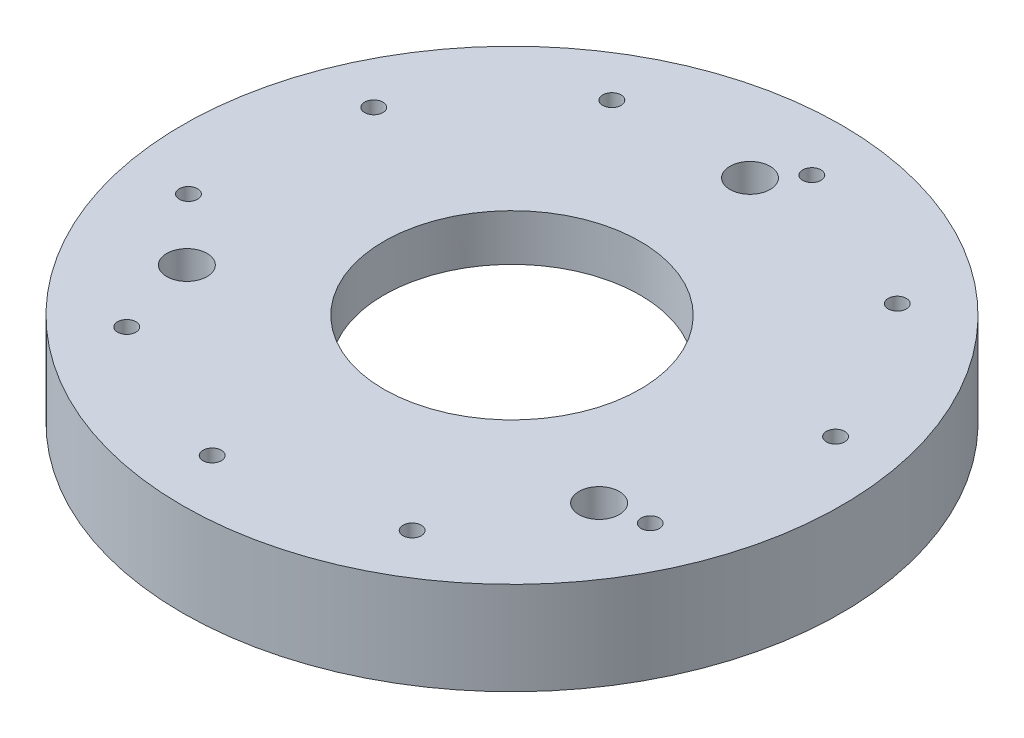
ISO-10303-21;
HEADER;
FILE_DESCRIPTION(('STEP AP214'),'2;1');
FILE_NAME('part.step','',(''),(''),'','','');
FILE_SCHEMA(('AUTOMOTIVE_DESIGN { 1 0 10303 214 1 1 1 1 }'));
ENDSEC;
DATA;
#1=APPLICATION_CONTEXT('core data for automotive mechanical design processes');
#2=APPLICATION_PROTOCOL_DEFINITION('international standard','automotive_design',2000,#1);
#3=PRODUCT_CONTEXT('',#1,'mechanical');
#4=PRODUCT('Part','Part','',(#3));
#5=PRODUCT_RELATED_PRODUCT_CATEGORY('part','',(#4));
#6=PRODUCT_DEFINITION_FORMATION('','',#4);
#7=PRODUCT_DEFINITION_CONTEXT('part definition',#1,'design');
#8=PRODUCT_DEFINITION('design','',#6,#7);
#9=PRODUCT_DEFINITION_SHAPE('','',#8);
#10=(LENGTH_UNIT() NAMED_UNIT(*) SI_UNIT(.MILLI.,.METRE.));
#11=(NAMED_UNIT(*) PLANE_ANGLE_UNIT() SI_UNIT($,.RADIAN.));
#12=(NAMED_UNIT(*) SI_UNIT($,.STERADIAN.) SOLID_ANGLE_UNIT());
#13=UNCERTAINTY_MEASURE_WITH_UNIT(LENGTH_MEASURE(1.E-05),#10,'distance_accuracy_value','');
#14=(GEOMETRIC_REPRESENTATION_CONTEXT(3) GLOBAL_UNCERTAINTY_ASSIGNED_CONTEXT((#13)) GLOBAL_UNIT_ASSIGNED_CONTEXT((#10,
#11,#12)) REPRESENTATION_CONTEXT('',''));
#15=CARTESIAN_POINT('',(0.,0.,0.));
#16=DIRECTION('',(0.,0.,1.));
#17=DIRECTION('',(1.,0.,0.));
#18=AXIS2_PLACEMENT_3D('',#15,#16,#17);
#19=CARTESIAN_POINT('',(0.,12.7,-32.5));
#20=DIRECTION('',(0.,-1.,0.));
#21=DIRECTION('',(0.,0.,-1.));
#22=AXIS2_PLACEMENT_3D('',#19,#20,#21);
#23=CYLINDRICAL_SURFACE('',#22,2.75);
#24=CARTESIAN_POINT('',(0.,12.7,-32.5));
#25=DIRECTION('',(0.,1.,0.));
#26=DIRECTION('',(0.,0.,1.));
#27=AXIS2_PLACEMENT_3D('',#24,#25,#26);
#28=CIRCLE('',#27,2.75);
#29=CARTESIAN_POINT('',(0.,12.7,-29.75));
#30=VERTEX_POINT('',#29);
#31=EDGE_CURVE('E203',#30,#30,#28,.T.);
#32=ORIENTED_EDGE('',*,*,#31,.T.);
#33=EDGE_LOOP('',(#32));
#34=FACE_BOUND('',#33,.T.);
#35=CARTESIAN_POINT('',(0.,6.35,-32.5));
#36=DIRECTION('',(0.,-1.,0.));
#37=DIRECTION('',(0.,0.,-1.));
#38=AXIS2_PLACEMENT_3D('',#35,#36,#37);
#39=CIRCLE('',#38,2.75);
#40=CARTESIAN_POINT('',(0.,6.35,-35.25));
#41=VERTEX_POINT('',#40);
#42=EDGE_CURVE('E120',#41,#41,#39,.T.);
#43=ORIENTED_EDGE('',*,*,#42,.T.);
#44=EDGE_LOOP('',(#43));
#45=FACE_BOUND('',#44,.T.);
#46=ADVANCED_FACE('F37',(#34,#45),#23,.F.);
#47=CARTESIAN_POINT('',(28.1458256229943,12.7,16.25));
#48=DIRECTION('',(0.,-1.,0.));
#49=DIRECTION('',(0.,0.,-1.));
#50=AXIS2_PLACEMENT_3D('',#47,#48,#49);
#51=CYLINDRICAL_SURFACE('',#50,2.75);
#52=CARTESIAN_POINT('',(28.1458256229943,12.7,16.25));
#53=DIRECTION('',(0.,1.,0.));
#54=DIRECTION('',(0.,0.,1.));
#55=AXIS2_PLACEMENT_3D('',#52,#53,#54);
#56=CIRCLE('',#55,2.75);
#57=CARTESIAN_POINT('',(28.1458256229943,12.7,19.));
#58=VERTEX_POINT('',#57);
#59=EDGE_CURVE('E196',#58,#58,#56,.T.);
#60=ORIENTED_EDGE('',*,*,#59,.T.);
#61=EDGE_LOOP('',(#60));
#62=FACE_BOUND('',#61,.T.);
#63=CARTESIAN_POINT('',(28.1458256229943,6.35,16.25));
#64=DIRECTION('',(0.,-1.,0.));
#65=DIRECTION('',(0.,0.,-1.));
#66=AXIS2_PLACEMENT_3D('',#63,#64,#65);
#67=CIRCLE('',#66,2.75);
#68=CARTESIAN_POINT('',(28.1458256229943,6.35,13.5));
#69=VERTEX_POINT('',#68);
#70=EDGE_CURVE('E116',#69,#69,#67,.T.);
#71=ORIENTED_EDGE('',*,*,#70,.T.);
#72=EDGE_LOOP('',(#71));
#73=FACE_BOUND('',#72,.T.);
#74=ADVANCED_FACE('F242',(#62,#73),#51,.F.);
#75=CARTESIAN_POINT('',(-28.1458256229943,12.7,16.25));
#76=DIRECTION('',(0.,-1.,0.));
#77=DIRECTION('',(0.,0.,-1.));
#78=AXIS2_PLACEMENT_3D('',#75,#76,#77);
#79=CYLINDRICAL_SURFACE('',#78,2.75);
#80=CARTESIAN_POINT('',(-28.1458256229943,12.7,16.25));
#81=DIRECTION('',(0.,1.,0.));
#82=DIRECTION('',(0.,0.,1.));
#83=AXIS2_PLACEMENT_3D('',#80,#81,#82);
#84=CIRCLE('',#83,2.75);
#85=CARTESIAN_POINT('',(-28.1458256229943,12.7,19.));
#86=VERTEX_POINT('',#85);
#87=EDGE_CURVE('E191',#86,#86,#84,.T.);
#88=ORIENTED_EDGE('',*,*,#87,.T.);
#89=EDGE_LOOP('',(#88));
#90=FACE_BOUND('',#89,.T.);
#91=CARTESIAN_POINT('',(-28.1458256229943,6.35,16.25));
#92=DIRECTION('',(0.,-1.,0.));
#93=DIRECTION('',(0.,0.,-1.));
#94=AXIS2_PLACEMENT_3D('',#91,#92,#93);
#95=CIRCLE('',#94,2.75);
#96=CARTESIAN_POINT('',(-28.1458256229943,6.35,13.5));
#97=VERTEX_POINT('',#96);
#98=EDGE_CURVE('E223',#97,#97,#95,.T.);
#99=ORIENTED_EDGE('',*,*,#98,.T.);
#100=EDGE_LOOP('',(#99));
#101=FACE_BOUND('',#100,.T.);
#102=ADVANCED_FACE('F244',(#90,#101),#79,.F.);
#103=CARTESIAN_POINT('',(0.,6.35,0.));
#104=DIRECTION('',(0.,-1.,0.));
#105=DIRECTION('',(0.,0.,-1.));
#106=AXIS2_PLACEMENT_3D('',#103,#104,#105);
#107=CYLINDRICAL_SURFACE('',#106,28.5);
#108=CARTESIAN_POINT('',(0.,6.35,0.));
#109=DIRECTION('',(0.,-1.,0.));
#110=DIRECTION('',(0.,0.,-1.));
#111=AXIS2_PLACEMENT_3D('',#108,#109,#110);
#112=CIRCLE('',#111,28.5);
#113=CARTESIAN_POINT('',(23.98200053742,6.35,15.3984950635828));
#114=VERTEX_POINT('',#113);
#115=CARTESIAN_POINT('',(-23.9820005374199,6.35,15.398495063583));
#116=VERTEX_POINT('',#115);
#117=EDGE_CURVE('E128',#114,#116,#112,.T.);
#118=ORIENTED_EDGE('',*,*,#117,.F.);
#119=DIRECTION('',(0.,-1.,0.));
#120=VECTOR('',#119,1.);
#121=CARTESIAN_POINT('',(23.98200053742,3.175,15.3984950635828));
#122=LINE('',#121,#120);
#123=CARTESIAN_POINT('',(23.98200053742,0.,15.3984950635828));
#124=VERTEX_POINT('',#123);
#125=EDGE_CURVE('E11',#114,#124,#122,.T.);
#126=ORIENTED_EDGE('',*,*,#125,.T.);
#127=CARTESIAN_POINT('',(0.,0.,0.));
#128=DIRECTION('',(0.,-1.,0.));
#129=DIRECTION('',(0.,0.,-1.));
#130=AXIS2_PLACEMENT_3D('',#127,#128,#129);
#131=CIRCLE('',#130,28.5);
#132=CARTESIAN_POINT('',(-23.9820005374199,0.,15.398495063583));
#133=VERTEX_POINT('',#132);
#134=EDGE_CURVE('E115',#124,#133,#131,.T.);
#135=ORIENTED_EDGE('',*,*,#134,.T.);
#136=DIRECTION('',(0.,-1.,0.));
#137=VECTOR('',#136,1.);
#138=CARTESIAN_POINT('',(-23.9820005374199,3.175,15.3984950635831));
#139=LINE('',#138,#137);
#140=EDGE_CURVE('E95',#133,#116,#139,.F.);
#141=ORIENTED_EDGE('',*,*,#140,.T.);
#142=EDGE_LOOP('',(#118,#126,#135,#141));
#143=FACE_BOUND('',#142,.T.);
#144=ADVANCED_FACE('F251',(#143),#107,.F.);
#145=CARTESIAN_POINT('',(1.34448763640207,0.,-28.4682692307692));
#146=VERTEX_POINT('',#145);
#147=CARTESIAN_POINT('',(25.326488173822,0.,13.0697741671864));
#148=VERTEX_POINT('',#147);
#149=EDGE_CURVE('E118',#146,#148,#131,.T.);
#150=ORIENTED_EDGE('',*,*,#149,.T.);
#151=DIRECTION('',(0.,-1.,0.));
#152=VECTOR('',#151,1.);
#153=CARTESIAN_POINT('',(25.326488173822,3.175,13.0697741671864));
#154=LINE('',#153,#152);
#155=CARTESIAN_POINT('',(25.326488173822,6.35,13.0697741671864));
#156=VERTEX_POINT('',#155);
#157=EDGE_CURVE('E45',#148,#156,#154,.F.);
#158=ORIENTED_EDGE('',*,*,#157,.T.);
#159=CARTESIAN_POINT('',(1.34448763640207,6.35,-28.4682692307692));
#160=VERTEX_POINT('',#159);
#161=EDGE_CURVE('E129',#160,#156,#112,.T.);
#162=ORIENTED_EDGE('',*,*,#161,.F.);
#163=DIRECTION('',(0.,-1.,0.));
#164=VECTOR('',#163,1.);
#165=CARTESIAN_POINT('',(1.34448763640213,3.175,-28.4682692307692));
#166=LINE('',#165,#164);
#167=EDGE_CURVE('E216',#160,#146,#166,.T.);
#168=ORIENTED_EDGE('',*,*,#167,.T.);
#169=EDGE_LOOP('',(#150,#158,#162,#168));
#170=FACE_BOUND('',#169,.T.);
#171=ADVANCED_FACE('F217',(#170),#107,.F.);
#172=CARTESIAN_POINT('',(0.,12.7,0.));
#173=DIRECTION('',(0.,1.,0.));
#174=DIRECTION('',(0.,0.,1.));
#175=AXIS2_PLACEMENT_3D('',#172,#173,#174);
#176=PLANE('',#175);
#177=CARTESIAN_POINT('',(0.,12.7,0.));
#178=DIRECTION('',(0.,1.,0.));
#179=DIRECTION('',(0.,0.,1.));
#180=AXIS2_PLACEMENT_3D('',#177,#178,#179);
#181=CIRCLE('',#180,17.5);
#182=CARTESIAN_POINT('',(0.,12.7,17.5));
#183=VERTEX_POINT('',#182);
#184=EDGE_CURVE('E133',#183,#183,#181,.T.);
#185=ORIENTED_EDGE('',*,*,#184,.F.);
#186=EDGE_LOOP('',(#185));
#187=FACE_BOUND('',#186,.T.);
#188=CARTESIAN_POINT('',(-3.8936852567201,12.7,37.0459406024682));
#189=DIRECTION('',(0.,1.,0.));
#190=DIRECTION('',(0.,0.,1.));
#191=AXIS2_PLACEMENT_3D('',#188,#189,#190);
#192=CIRCLE('',#191,1.25);
#193=CARTESIAN_POINT('',(-3.8936852567201,12.7,38.2959406024682));
#194=VERTEX_POINT('',#193);
#195=EDGE_CURVE('E146',#194,#194,#192,.T.);
#196=ORIENTED_EDGE('',*,*,#195,.F.);
#197=EDGE_LOOP('',(#196));
#198=FACE_BOUND('',#197,.T.);
#199=CARTESIAN_POINT('',(34.0295682971869,12.7,15.1509399545736));
#200=DIRECTION('',(0.,1.,0.));
#201=DIRECTION('',(0.,0.,1.));
#202=AXIS2_PLACEMENT_3D('',#199,#200,#201);
#203=CIRCLE('',#202,1.25000000000001);
#204=CARTESIAN_POINT('',(34.0295682971869,12.7,16.4009399545736));
#205=VERTEX_POINT('',#204);
#206=EDGE_CURVE('E158',#205,#205,#203,.T.);
#207=ORIENTED_EDGE('',*,*,#206,.F.);
#208=EDGE_LOOP('',(#207));
#209=FACE_BOUND('',#208,.T.);
#210=CARTESIAN_POINT('',(24.9251150868675,12.7,-27.6821447490329));
#211=DIRECTION('',(0.,1.,0.));
#212=DIRECTION('',(0.,0.,1.));
#213=AXIS2_PLACEMENT_3D('',#210,#211,#212);
#214=CIRCLE('',#213,1.25);
#215=CARTESIAN_POINT('',(24.9251150868675,12.7,-26.4321447490329));
#216=VERTEX_POINT('',#215);
#217=EDGE_CURVE('E170',#216,#216,#214,.T.);
#218=ORIENTED_EDGE('',*,*,#217,.F.);
#219=EDGE_LOOP('',(#218));
#220=FACE_BOUND('',#219,.T.);
#221=CARTESIAN_POINT('',(-18.625,12.7,-32.2594462909704));
#222=DIRECTION('',(0.,1.,0.));
#223=DIRECTION('',(0.,0.,1.));
#224=AXIS2_PLACEMENT_3D('',#221,#222,#223);
#225=CIRCLE('',#224,1.25);
#226=CARTESIAN_POINT('',(-18.625,12.7,-31.0094462909704));
#227=VERTEX_POINT('',#226);
#228=EDGE_CURVE('E182',#227,#227,#225,.T.);
#229=ORIENTED_EDGE('',*,*,#228,.F.);
#230=EDGE_LOOP('',(#229));
#231=FACE_BOUND('',#230,.T.);
#232=ORIENTED_EDGE('',*,*,#87,.F.);
#233=EDGE_LOOP('',(#232));
#234=FACE_BOUND('',#233,.T.);
#235=CARTESIAN_POINT('',(-36.4359981273343,12.7,7.74471048296152));
#236=DIRECTION('',(0.,1.,0.));
#237=DIRECTION('',(0.,0.,1.));
#238=AXIS2_PLACEMENT_3D('',#235,#236,#237);
#239=CIRCLE('',#238,1.25000000000001);
#240=CARTESIAN_POINT('',(-36.4359981273343,12.7,8.99471048296152));
#241=VERTEX_POINT('',#240);
#242=EDGE_CURVE('E200',#241,#241,#239,.T.);
#243=ORIENTED_EDGE('',*,*,#242,.F.);
#244=EDGE_LOOP('',(#243));
#245=FACE_BOUND('',#244,.T.);
#246=CARTESIAN_POINT('',(0.,12.7,0.));
#247=DIRECTION('',(0.,1.,0.));
#248=DIRECTION('',(0.,0.,1.));
#249=AXIS2_PLACEMENT_3D('',#246,#247,#248);
#250=CIRCLE('',#249,45.);
#251=CARTESIAN_POINT('',(0.,12.7,45.));
#252=VERTEX_POINT('',#251);
#253=EDGE_CURVE('E209',#252,#252,#250,.T.);
#254=ORIENTED_EDGE('',*,*,#253,.T.);
#255=EDGE_LOOP('',(#254));
#256=FACE_BOUND('',#255,.T.);
#257=ORIENTED_EDGE('',*,*,#31,.F.);
#258=EDGE_LOOP('',(#257));
#259=FACE_BOUND('',#258,.T.);
#260=ORIENTED_EDGE('',*,*,#59,.F.);
#261=EDGE_LOOP('',(#260));
#262=FACE_BOUND('',#261,.T.);
#263=CARTESIAN_POINT('',(-34.0295682971869,12.7,-15.1509399545736));
#264=DIRECTION('',(0.,1.,0.));
#265=DIRECTION('',(0.,0.,1.));
#266=AXIS2_PLACEMENT_3D('',#263,#264,#265);
#267=CIRCLE('',#266,1.25000000000001);
#268=CARTESIAN_POINT('',(-34.0295682971869,12.7,-13.9009399545736));
#269=VERTEX_POINT('',#268);
#270=EDGE_CURVE('E188',#269,#269,#267,.T.);
#271=ORIENTED_EDGE('',*,*,#270,.F.);
#272=EDGE_LOOP('',(#271));
#273=FACE_BOUND('',#272,.T.);
#274=CARTESIAN_POINT('',(3.8936852567201,12.7,-37.0459406024682));
#275=DIRECTION('',(0.,1.,0.));
#276=DIRECTION('',(0.,0.,1.));
#277=AXIS2_PLACEMENT_3D('',#274,#275,#276);
#278=CIRCLE('',#277,1.25);
#279=CARTESIAN_POINT('',(3.8936852567201,12.7,-35.7959406024682));
#280=VERTEX_POINT('',#279);
#281=EDGE_CURVE('E176',#280,#280,#278,.T.);
#282=ORIENTED_EDGE('',*,*,#281,.F.);
#283=EDGE_LOOP('',(#282));
#284=FACE_BOUND('',#283,.T.);
#285=CARTESIAN_POINT('',(36.4359981273343,12.7,-7.74471048296153));
#286=DIRECTION('',(0.,1.,0.));
#287=DIRECTION('',(0.,0.,1.));
#288=AXIS2_PLACEMENT_3D('',#285,#286,#287);
#289=CIRCLE('',#288,1.25);
#290=CARTESIAN_POINT('',(36.4359981273343,12.7,-6.49471048296152));
#291=VERTEX_POINT('',#290);
#292=EDGE_CURVE('E164',#291,#291,#289,.T.);
#293=ORIENTED_EDGE('',*,*,#292,.F.);
#294=EDGE_LOOP('',(#293));
#295=FACE_BOUND('',#294,.T.);
#296=CARTESIAN_POINT('',(18.625,12.7,32.2594462909704));
#297=DIRECTION('',(0.,1.,0.));
#298=DIRECTION('',(0.,0.,1.));
#299=AXIS2_PLACEMENT_3D('',#296,#297,#298);
#300=CIRCLE('',#299,1.25);
#301=CARTESIAN_POINT('',(18.625,12.7,33.5094462909704));
#302=VERTEX_POINT('',#301);
#303=EDGE_CURVE('E152',#302,#302,#300,.T.);
#304=ORIENTED_EDGE('',*,*,#303,.F.);
#305=EDGE_LOOP('',(#304));
#306=FACE_BOUND('',#305,.T.);
#307=CARTESIAN_POINT('',(-24.9251150868675,12.7,27.6821447490329));
#308=DIRECTION('',(0.,1.,0.));
#309=DIRECTION('',(0.,0.,1.));
#310=AXIS2_PLACEMENT_3D('',#307,#308,#309);
#311=CIRCLE('',#310,1.25);
#312=CARTESIAN_POINT('',(-24.9251150868675,12.7,28.9321447490329));
#313=VERTEX_POINT('',#312);
#314=EDGE_CURVE('E140',#313,#313,#311,.T.);
#315=ORIENTED_EDGE('',*,*,#314,.F.);
#316=EDGE_LOOP('',(#315));
#317=FACE_BOUND('',#316,.T.);
#318=ADVANCED_FACE('F263',(#187,#198,#209,#220,#231,#234,#245,#256,#259,#262,#273,#284,#295,
#306,#317),#176,.T.);
#319=CARTESIAN_POINT('',(0.,0.,0.));
#320=DIRECTION('',(0.,1.,0.));
#321=DIRECTION('',(0.,0.,1.));
#322=AXIS2_PLACEMENT_3D('',#319,#320,#321);
#323=PLANE('',#322);
#324=ORIENTED_EDGE('',*,*,#134,.F.);
#325=CARTESIAN_POINT('',(28.1458256229943,0.,16.25));
#326=DIRECTION('',(0.,-1.,0.));
#327=DIRECTION('',(0.,0.,-1.));
#328=AXIS2_PLACEMENT_3D('',#325,#326,#327);
#329=CIRCLE('',#328,4.25);
#330=EDGE_CURVE('E221',#148,#124,#329,.T.);
#331=ORIENTED_EDGE('',*,*,#330,.F.);
#332=ORIENTED_EDGE('',*,*,#149,.F.);
#333=CARTESIAN_POINT('',(0.,0.,-32.5));
#334=DIRECTION('',(0.,-1.,0.));
#335=DIRECTION('',(0.,0.,-1.));
#336=AXIS2_PLACEMENT_3D('',#333,#334,#335);
#337=CIRCLE('',#336,4.25000000000003);
#338=CARTESIAN_POINT('',(-1.34448763640202,0.,-28.4682692307692));
#339=VERTEX_POINT('',#338);
#340=EDGE_CURVE('E114',#339,#146,#337,.T.);
#341=ORIENTED_EDGE('',*,*,#340,.F.);
#342=CARTESIAN_POINT('',(-25.3264881738221,0.,13.0697741671862));
#343=VERTEX_POINT('',#342);
#344=EDGE_CURVE('E106',#343,#339,#131,.T.);
#345=ORIENTED_EDGE('',*,*,#344,.F.);
#346=CARTESIAN_POINT('',(-28.1458256229943,0.,16.25));
#347=DIRECTION('',(0.,-1.,0.));
#348=DIRECTION('',(0.,0.,-1.));
#349=AXIS2_PLACEMENT_3D('',#346,#347,#348);
#350=CIRCLE('',#349,4.25000000000007);
#351=EDGE_CURVE('E89',#133,#343,#350,.T.);
#352=ORIENTED_EDGE('',*,*,#351,.F.);
#353=EDGE_LOOP('',(#324,#331,#332,#341,#345,#352));
#354=FACE_BOUND('',#353,.T.);
#355=CARTESIAN_POINT('',(0.,0.,0.));
#356=DIRECTION('',(0.,1.,0.));
#357=DIRECTION('',(0.,0.,1.));
#358=AXIS2_PLACEMENT_3D('',#355,#356,#357);
#359=CIRCLE('',#358,45.);
#360=CARTESIAN_POINT('',(0.,0.,45.));
#361=VERTEX_POINT('',#360);
#362=EDGE_CURVE('E208',#361,#361,#359,.T.);
#363=ORIENTED_EDGE('',*,*,#362,.F.);
#364=EDGE_LOOP('',(#363));
#365=FACE_BOUND('',#364,.T.);
#366=CARTESIAN_POINT('',(-36.4359981273343,0.,7.74471048296152));
#367=DIRECTION('',(0.,1.,0.));
#368=DIRECTION('',(0.,0.,1.));
#369=AXIS2_PLACEMENT_3D('',#366,#367,#368);
#370=CIRCLE('',#369,1.25000000000001);
#371=CARTESIAN_POINT('',(-36.4359981273343,0.,8.99471048296152));
#372=VERTEX_POINT('',#371);
#373=EDGE_CURVE('E199',#372,#372,#370,.T.);
#374=ORIENTED_EDGE('',*,*,#373,.T.);
#375=EDGE_LOOP('',(#374));
#376=FACE_BOUND('',#375,.T.);
#377=CARTESIAN_POINT('',(-34.0295682971869,0.,-15.1509399545736));
#378=DIRECTION('',(0.,1.,0.));
#379=DIRECTION('',(0.,0.,1.));
#380=AXIS2_PLACEMENT_3D('',#377,#378,#379);
#381=CIRCLE('',#380,1.25000000000001);
#382=CARTESIAN_POINT('',(-34.0295682971869,0.,-13.9009399545736));
#383=VERTEX_POINT('',#382);
#384=EDGE_CURVE('E185',#383,#383,#381,.T.);
#385=ORIENTED_EDGE('',*,*,#384,.T.);
#386=EDGE_LOOP('',(#385));
#387=FACE_BOUND('',#386,.T.);
#388=CARTESIAN_POINT('',(-18.625,0.,-32.2594462909704));
#389=DIRECTION('',(0.,1.,0.));
#390=DIRECTION('',(0.,0.,1.));
#391=AXIS2_PLACEMENT_3D('',#388,#389,#390);
#392=CIRCLE('',#391,1.25);
#393=CARTESIAN_POINT('',(-18.625,0.,-31.0094462909704));
#394=VERTEX_POINT('',#393);
#395=EDGE_CURVE('E179',#394,#394,#392,.T.);
#396=ORIENTED_EDGE('',*,*,#395,.T.);
#397=EDGE_LOOP('',(#396));
#398=FACE_BOUND('',#397,.T.);
#399=CARTESIAN_POINT('',(3.8936852567201,0.,-37.0459406024682));
#400=DIRECTION('',(0.,1.,0.));
#401=DIRECTION('',(0.,0.,1.));
#402=AXIS2_PLACEMENT_3D('',#399,#400,#401);
#403=CIRCLE('',#402,1.25);
#404=CARTESIAN_POINT('',(3.8936852567201,0.,-35.7959406024682));
#405=VERTEX_POINT('',#404);
#406=EDGE_CURVE('E173',#405,#405,#403,.T.);
#407=ORIENTED_EDGE('',*,*,#406,.T.);
#408=EDGE_LOOP('',(#407));
#409=FACE_BOUND('',#408,.T.);
#410=CARTESIAN_POINT('',(24.9251150868675,0.,-27.6821447490329));
#411=DIRECTION('',(0.,1.,0.));
#412=DIRECTION('',(0.,0.,1.));
#413=AXIS2_PLACEMENT_3D('',#410,#411,#412);
#414=CIRCLE('',#413,1.25);
#415=CARTESIAN_POINT('',(24.9251150868675,0.,-26.4321447490329));
#416=VERTEX_POINT('',#415);
#417=EDGE_CURVE('E167',#416,#416,#414,.T.);
#418=ORIENTED_EDGE('',*,*,#417,.T.);
#419=EDGE_LOOP('',(#418));
#420=FACE_BOUND('',#419,.T.);
#421=CARTESIAN_POINT('',(36.4359981273343,0.,-7.74471048296153));
#422=DIRECTION('',(0.,1.,0.));
#423=DIRECTION('',(0.,0.,1.));
#424=AXIS2_PLACEMENT_3D('',#421,#422,#423);
#425=CIRCLE('',#424,1.25);
#426=CARTESIAN_POINT('',(36.4359981273343,0.,-6.49471048296152));
#427=VERTEX_POINT('',#426);
#428=EDGE_CURVE('E161',#427,#427,#425,.T.);
#429=ORIENTED_EDGE('',*,*,#428,.T.);
#430=EDGE_LOOP('',(#429));
#431=FACE_BOUND('',#430,.T.);
#432=CARTESIAN_POINT('',(34.0295682971869,0.,15.1509399545736));
#433=DIRECTION('',(0.,1.,0.));
#434=DIRECTION('',(0.,0.,1.));
#435=AXIS2_PLACEMENT_3D('',#432,#433,#434);
#436=CIRCLE('',#435,1.25000000000001);
#437=CARTESIAN_POINT('',(34.0295682971869,0.,16.4009399545736));
#438=VERTEX_POINT('',#437);
#439=EDGE_CURVE('E155',#438,#438,#436,.T.);
#440=ORIENTED_EDGE('',*,*,#439,.T.);
#441=EDGE_LOOP('',(#440));
#442=FACE_BOUND('',#441,.T.);
#443=CARTESIAN_POINT('',(18.625,0.,32.2594462909704));
#444=DIRECTION('',(0.,1.,0.));
#445=DIRECTION('',(0.,0.,1.));
#446=AXIS2_PLACEMENT_3D('',#443,#444,#445);
#447=CIRCLE('',#446,1.25);
#448=CARTESIAN_POINT('',(18.625,0.,33.5094462909704));
#449=VERTEX_POINT('',#448);
#450=EDGE_CURVE('E149',#449,#449,#447,.T.);
#451=ORIENTED_EDGE('',*,*,#450,.T.);
#452=EDGE_LOOP('',(#451));
#453=FACE_BOUND('',#452,.T.);
#454=CARTESIAN_POINT('',(-3.8936852567201,0.,37.0459406024682));
#455=DIRECTION('',(0.,1.,0.));
#456=DIRECTION('',(0.,0.,1.));
#457=AXIS2_PLACEMENT_3D('',#454,#455,#456);
#458=CIRCLE('',#457,1.25);
#459=CARTESIAN_POINT('',(-3.8936852567201,0.,38.2959406024682));
#460=VERTEX_POINT('',#459);
#461=EDGE_CURVE('E143',#460,#460,#458,.T.);
#462=ORIENTED_EDGE('',*,*,#461,.T.);
#463=EDGE_LOOP('',(#462));
#464=FACE_BOUND('',#463,.T.);
#465=CARTESIAN_POINT('',(-24.9251150868675,0.,27.6821447490329));
#466=DIRECTION('',(0.,1.,0.));
#467=DIRECTION('',(0.,0.,1.));
#468=AXIS2_PLACEMENT_3D('',#465,#466,#467);
#469=CIRCLE('',#468,1.25);
#470=CARTESIAN_POINT('',(-24.9251150868675,0.,28.9321447490329));
#471=VERTEX_POINT('',#470);
#472=EDGE_CURVE('E137',#471,#471,#469,.T.);
#473=ORIENTED_EDGE('',*,*,#472,.T.);
#474=EDGE_LOOP('',(#473));
#475=FACE_BOUND('',#474,.T.);
#476=ADVANCED_FACE('F111',(#354,#365,#376,#387,#398,#409,#420,#431,#442,#453,#464,#475),#323,.F.);
#477=CARTESIAN_POINT('',(0.,12.7,0.));
#478=DIRECTION('',(0.,-1.,0.));
#479=DIRECTION('',(0.,0.,-1.));
#480=AXIS2_PLACEMENT_3D('',#477,#478,#479);
#481=CYLINDRICAL_SURFACE('',#480,45.);
#482=ORIENTED_EDGE('',*,*,#253,.F.);
#483=EDGE_LOOP('',(#482));
#484=FACE_BOUND('',#483,.T.);
#485=ORIENTED_EDGE('',*,*,#362,.T.);
#486=EDGE_LOOP('',(#485));
#487=FACE_BOUND('',#486,.T.);
#488=ADVANCED_FACE('F39',(#484,#487),#481,.T.);
#489=CARTESIAN_POINT('',(-36.4359981273343,12.7,7.74471048296152));
#490=DIRECTION('',(0.,-1.,0.));
#491=DIRECTION('',(0.,0.,-1.));
#492=AXIS2_PLACEMENT_3D('',#489,#490,#491);
#493=CYLINDRICAL_SURFACE('',#492,1.25000000000001);
#494=ORIENTED_EDGE('',*,*,#242,.T.);
#495=EDGE_LOOP('',(#494));
#496=FACE_BOUND('',#495,.T.);
#497=ORIENTED_EDGE('',*,*,#373,.F.);
#498=EDGE_LOOP('',(#497));
#499=FACE_BOUND('',#498,.T.);
#500=ADVANCED_FACE('F258',(#496,#499),#493,.F.);
#501=CARTESIAN_POINT('',(-34.0295682971869,12.7,-15.1509399545736));
#502=DIRECTION('',(0.,-1.,0.));
#503=DIRECTION('',(0.,0.,-1.));
#504=AXIS2_PLACEMENT_3D('',#501,#502,#503);
#505=CYLINDRICAL_SURFACE('',#504,1.25000000000001);
#506=ORIENTED_EDGE('',*,*,#270,.T.);
#507=EDGE_LOOP('',(#506));
#508=FACE_BOUND('',#507,.T.);
#509=ORIENTED_EDGE('',*,*,#384,.F.);
#510=EDGE_LOOP('',(#509));
#511=FACE_BOUND('',#510,.T.);
#512=ADVANCED_FACE('F260',(#508,#511),#505,.F.);
#513=CARTESIAN_POINT('',(-18.625,12.7,-32.2594462909704));
#514=DIRECTION('',(0.,-1.,0.));
#515=DIRECTION('',(0.,0.,-1.));
#516=AXIS2_PLACEMENT_3D('',#513,#514,#515);
#517=CYLINDRICAL_SURFACE('',#516,1.25);
#518=ORIENTED_EDGE('',*,*,#228,.T.);
#519=EDGE_LOOP('',(#518));
#520=FACE_BOUND('',#519,.T.);
#521=ORIENTED_EDGE('',*,*,#395,.F.);
#522=EDGE_LOOP('',(#521));
#523=FACE_BOUND('',#522,.T.);
#524=ADVANCED_FACE('F331',(#520,#523),#517,.F.);
#525=CARTESIAN_POINT('',(3.8936852567201,12.7,-37.0459406024682));
#526=DIRECTION('',(0.,-1.,0.));
#527=DIRECTION('',(0.,0.,-1.));
#528=AXIS2_PLACEMENT_3D('',#525,#526,#527);
#529=CYLINDRICAL_SURFACE('',#528,1.25);
#530=ORIENTED_EDGE('',*,*,#281,.T.);
#531=EDGE_LOOP('',(#530));
#532=FACE_BOUND('',#531,.T.);
#533=ORIENTED_EDGE('',*,*,#406,.F.);
#534=EDGE_LOOP('',(#533));
#535=FACE_BOUND('',#534,.T.);
#536=ADVANCED_FACE('F327',(#532,#535),#529,.F.);
#537=CARTESIAN_POINT('',(24.9251150868675,12.7,-27.6821447490329));
#538=DIRECTION('',(0.,-1.,0.));
#539=DIRECTION('',(0.,0.,-1.));
#540=AXIS2_PLACEMENT_3D('',#537,#538,#539);
#541=CYLINDRICAL_SURFACE('',#540,1.25);
#542=ORIENTED_EDGE('',*,*,#217,.T.);
#543=EDGE_LOOP('',(#542));
#544=FACE_BOUND('',#543,.T.);
#545=ORIENTED_EDGE('',*,*,#417,.F.);
#546=EDGE_LOOP('',(#545));
#547=FACE_BOUND('',#546,.T.);
#548=ADVANCED_FACE('F323',(#544,#547),#541,.F.);
#549=CARTESIAN_POINT('',(36.4359981273343,12.7,-7.74471048296153));
#550=DIRECTION('',(0.,-1.,0.));
#551=DIRECTION('',(0.,0.,-1.));
#552=AXIS2_PLACEMENT_3D('',#549,#550,#551);
#553=CYLINDRICAL_SURFACE('',#552,1.25);
#554=ORIENTED_EDGE('',*,*,#292,.T.);
#555=EDGE_LOOP('',(#554));
#556=FACE_BOUND('',#555,.T.);
#557=ORIENTED_EDGE('',*,*,#428,.F.);
#558=EDGE_LOOP('',(#557));
#559=FACE_BOUND('',#558,.T.);
#560=ADVANCED_FACE('F319',(#556,#559),#553,.F.);
#561=CARTESIAN_POINT('',(34.0295682971869,12.7,15.1509399545736));
#562=DIRECTION('',(0.,-1.,0.));
#563=DIRECTION('',(0.,0.,-1.));
#564=AXIS2_PLACEMENT_3D('',#561,#562,#563);
#565=CYLINDRICAL_SURFACE('',#564,1.25000000000001);
#566=ORIENTED_EDGE('',*,*,#206,.T.);
#567=EDGE_LOOP('',(#566));
#568=FACE_BOUND('',#567,.T.);
#569=ORIENTED_EDGE('',*,*,#439,.F.);
#570=EDGE_LOOP('',(#569));
#571=FACE_BOUND('',#570,.T.);
#572=ADVANCED_FACE('F315',(#568,#571),#565,.F.);
#573=CARTESIAN_POINT('',(18.625,12.7,32.2594462909704));
#574=DIRECTION('',(0.,-1.,0.));
#575=DIRECTION('',(0.,0.,-1.));
#576=AXIS2_PLACEMENT_3D('',#573,#574,#575);
#577=CYLINDRICAL_SURFACE('',#576,1.25);
#578=ORIENTED_EDGE('',*,*,#303,.T.);
#579=EDGE_LOOP('',(#578));
#580=FACE_BOUND('',#579,.T.);
#581=ORIENTED_EDGE('',*,*,#450,.F.);
#582=EDGE_LOOP('',(#581));
#583=FACE_BOUND('',#582,.T.);
#584=ADVANCED_FACE('F308',(#580,#583),#577,.F.);
#585=CARTESIAN_POINT('',(-3.8936852567201,12.7,37.0459406024682));
#586=DIRECTION('',(0.,-1.,0.));
#587=DIRECTION('',(0.,0.,-1.));
#588=AXIS2_PLACEMENT_3D('',#585,#586,#587);
#589=CYLINDRICAL_SURFACE('',#588,1.25);
#590=ORIENTED_EDGE('',*,*,#195,.T.);
#591=EDGE_LOOP('',(#590));
#592=FACE_BOUND('',#591,.T.);
#593=ORIENTED_EDGE('',*,*,#461,.F.);
#594=EDGE_LOOP('',(#593));
#595=FACE_BOUND('',#594,.T.);
#596=ADVANCED_FACE('F299',(#592,#595),#589,.F.);
#597=CARTESIAN_POINT('',(-24.9251150868675,12.7,27.6821447490329));
#598=DIRECTION('',(0.,-1.,0.));
#599=DIRECTION('',(0.,0.,-1.));
#600=AXIS2_PLACEMENT_3D('',#597,#598,#599);
#601=CYLINDRICAL_SURFACE('',#600,1.25);
#602=ORIENTED_EDGE('',*,*,#314,.T.);
#603=EDGE_LOOP('',(#602));
#604=FACE_BOUND('',#603,.T.);
#605=ORIENTED_EDGE('',*,*,#472,.F.);
#606=EDGE_LOOP('',(#605));
#607=FACE_BOUND('',#606,.T.);
#608=ADVANCED_FACE('F297',(#604,#607),#601,.F.);
#609=CARTESIAN_POINT('',(0.,6.35,0.));
#610=DIRECTION('',(0.,1.,0.));
#611=DIRECTION('',(0.,0.,1.));
#612=AXIS2_PLACEMENT_3D('',#609,#610,#611);
#613=CYLINDRICAL_SURFACE('',#612,17.5);
#614=CARTESIAN_POINT('',(0.,6.35,0.));
#615=DIRECTION('',(0.,-1.,0.));
#616=DIRECTION('',(0.,0.,-1.));
#617=AXIS2_PLACEMENT_3D('',#614,#615,#616);
#618=CIRCLE('',#617,17.5);
#619=CARTESIAN_POINT('',(0.,6.35,-17.5));
#620=VERTEX_POINT('',#619);
#621=EDGE_CURVE('E130',#620,#620,#618,.F.);
#622=ORIENTED_EDGE('',*,*,#621,.F.);
#623=EDGE_LOOP('',(#622));
#624=FACE_BOUND('',#623,.T.);
#625=ORIENTED_EDGE('',*,*,#184,.T.);
#626=EDGE_LOOP('',(#625));
#627=FACE_BOUND('',#626,.T.);
#628=ADVANCED_FACE('F238',(#624,#627),#613,.F.);
#629=CARTESIAN_POINT('',(0.,6.35,0.));
#630=DIRECTION('',(0.,-1.,0.));
#631=DIRECTION('',(0.,0.,-1.));
#632=AXIS2_PLACEMENT_3D('',#629,#630,#631);
#633=PLANE('',#632);
#634=ORIENTED_EDGE('',*,*,#161,.T.);
#635=CARTESIAN_POINT('',(28.1458256229943,6.35,16.25));
#636=DIRECTION('',(0.,-1.,0.));
#637=DIRECTION('',(0.,0.,-1.));
#638=AXIS2_PLACEMENT_3D('',#635,#636,#637);
#639=CIRCLE('',#638,4.25);
#640=EDGE_CURVE('E58',#156,#114,#639,.T.);
#641=ORIENTED_EDGE('',*,*,#640,.T.);
#642=ORIENTED_EDGE('',*,*,#117,.T.);
#643=CARTESIAN_POINT('',(-28.1458256229943,6.35,16.25));
#644=DIRECTION('',(0.,-1.,0.));
#645=DIRECTION('',(0.,0.,-1.));
#646=AXIS2_PLACEMENT_3D('',#643,#644,#645);
#647=CIRCLE('',#646,4.25000000000007);
#648=CARTESIAN_POINT('',(-25.3264881738221,6.35,13.0697741671862));
#649=VERTEX_POINT('',#648);
#650=EDGE_CURVE('E52',#116,#649,#647,.T.);
#651=ORIENTED_EDGE('',*,*,#650,.T.);
#652=CARTESIAN_POINT('',(-1.34448763640202,6.35,-28.4682692307692));
#653=VERTEX_POINT('',#652);
#654=EDGE_CURVE('E107',#649,#653,#112,.T.);
#655=ORIENTED_EDGE('',*,*,#654,.T.);
#656=CARTESIAN_POINT('',(0.,6.35,-32.5));
#657=DIRECTION('',(0.,-1.,0.));
#658=DIRECTION('',(0.,0.,-1.));
#659=AXIS2_PLACEMENT_3D('',#656,#657,#658);
#660=CIRCLE('',#659,4.25000000000003);
#661=EDGE_CURVE('E100',#653,#160,#660,.T.);
#662=ORIENTED_EDGE('',*,*,#661,.T.);
#663=EDGE_LOOP('',(#634,#641,#642,#651,#655,#662));
#664=FACE_BOUND('',#663,.T.);
#665=ORIENTED_EDGE('',*,*,#621,.T.);
#666=EDGE_LOOP('',(#665));
#667=FACE_BOUND('',#666,.T.);
#668=ORIENTED_EDGE('',*,*,#98,.F.);
#669=EDGE_LOOP('',(#668));
#670=FACE_BOUND('',#669,.T.);
#671=ORIENTED_EDGE('',*,*,#42,.F.);
#672=EDGE_LOOP('',(#671));
#673=FACE_BOUND('',#672,.T.);
#674=ORIENTED_EDGE('',*,*,#70,.F.);
#675=EDGE_LOOP('',(#674));
#676=FACE_BOUND('',#675,.T.);
#677=ADVANCED_FACE('F235',(#664,#667,#670,#673,#676),#633,.T.);
#678=ORIENTED_EDGE('',*,*,#344,.T.);
#679=DIRECTION('',(0.,-1.,0.));
#680=VECTOR('',#679,1.);
#681=CARTESIAN_POINT('',(-1.34448763640208,3.175,-28.4682692307693));
#682=LINE('',#681,#680);
#683=EDGE_CURVE('E108',#339,#653,#682,.F.);
#684=ORIENTED_EDGE('',*,*,#683,.T.);
#685=ORIENTED_EDGE('',*,*,#654,.F.);
#686=DIRECTION('',(0.,-1.,0.));
#687=VECTOR('',#686,1.);
#688=CARTESIAN_POINT('',(-25.3264881738221,3.175,13.0697741671862));
#689=LINE('',#688,#687);
#690=EDGE_CURVE('E92',#649,#343,#689,.T.);
#691=ORIENTED_EDGE('',*,*,#690,.T.);
#692=EDGE_LOOP('',(#678,#684,#685,#691));
#693=FACE_BOUND('',#692,.T.);
#694=ADVANCED_FACE('F104',(#693),#107,.F.);
#695=CARTESIAN_POINT('',(-28.1458256229943,6.35,16.25));
#696=DIRECTION('',(0.,-1.,0.));
#697=DIRECTION('',(0.,0.,-1.));
#698=AXIS2_PLACEMENT_3D('',#695,#696,#697);
#699=CYLINDRICAL_SURFACE('',#698,4.25000000000007);
#700=ORIENTED_EDGE('',*,*,#650,.F.);
#701=ORIENTED_EDGE('',*,*,#140,.F.);
#702=ORIENTED_EDGE('',*,*,#351,.T.);
#703=ORIENTED_EDGE('',*,*,#690,.F.);
#704=EDGE_LOOP('',(#700,#701,#702,#703));
#705=FACE_BOUND('',#704,.T.);
#706=ADVANCED_FACE('F91',(#705),#699,.F.);
#707=CARTESIAN_POINT('',(0.,6.35,-32.5));
#708=DIRECTION('',(0.,-1.,0.));
#709=DIRECTION('',(0.,0.,-1.));
#710=AXIS2_PLACEMENT_3D('',#707,#708,#709);
#711=CYLINDRICAL_SURFACE('',#710,4.25000000000003);
#712=ORIENTED_EDGE('',*,*,#661,.F.);
#713=ORIENTED_EDGE('',*,*,#683,.F.);
#714=ORIENTED_EDGE('',*,*,#340,.T.);
#715=ORIENTED_EDGE('',*,*,#167,.F.);
#716=EDGE_LOOP('',(#712,#713,#714,#715));
#717=FACE_BOUND('',#716,.T.);
#718=ADVANCED_FACE('F466',(#717),#711,.F.);
#719=CARTESIAN_POINT('',(28.1458256229943,6.35,16.25));
#720=DIRECTION('',(0.,-1.,0.));
#721=DIRECTION('',(0.,0.,-1.));
#722=AXIS2_PLACEMENT_3D('',#719,#720,#721);
#723=CYLINDRICAL_SURFACE('',#722,4.25);
#724=ORIENTED_EDGE('',*,*,#640,.F.);
#725=ORIENTED_EDGE('',*,*,#157,.F.);
#726=ORIENTED_EDGE('',*,*,#330,.T.);
#727=ORIENTED_EDGE('',*,*,#125,.F.);
#728=EDGE_LOOP('',(#724,#725,#726,#727));
#729=FACE_BOUND('',#728,.T.);
#730=ADVANCED_FACE('F220',(#729),#723,.F.);
#731=CLOSED_SHELL('',(#46,#74,#102,#144,#171,#318,#476,#488,#500,#512,#524,#536,#548,#560,#572,
#584,#596,#608,#628,#677,#694,#706,#718,#730));
#732=MANIFOLD_SOLID_BREP('B2',#731);
#733=ADVANCED_BREP_SHAPE_REPRESENTATION('',(#18,#732),#14);
#734=SHAPE_DEFINITION_REPRESENTATION(#9,#733);
ENDSEC;
END-ISO-10303-21;
